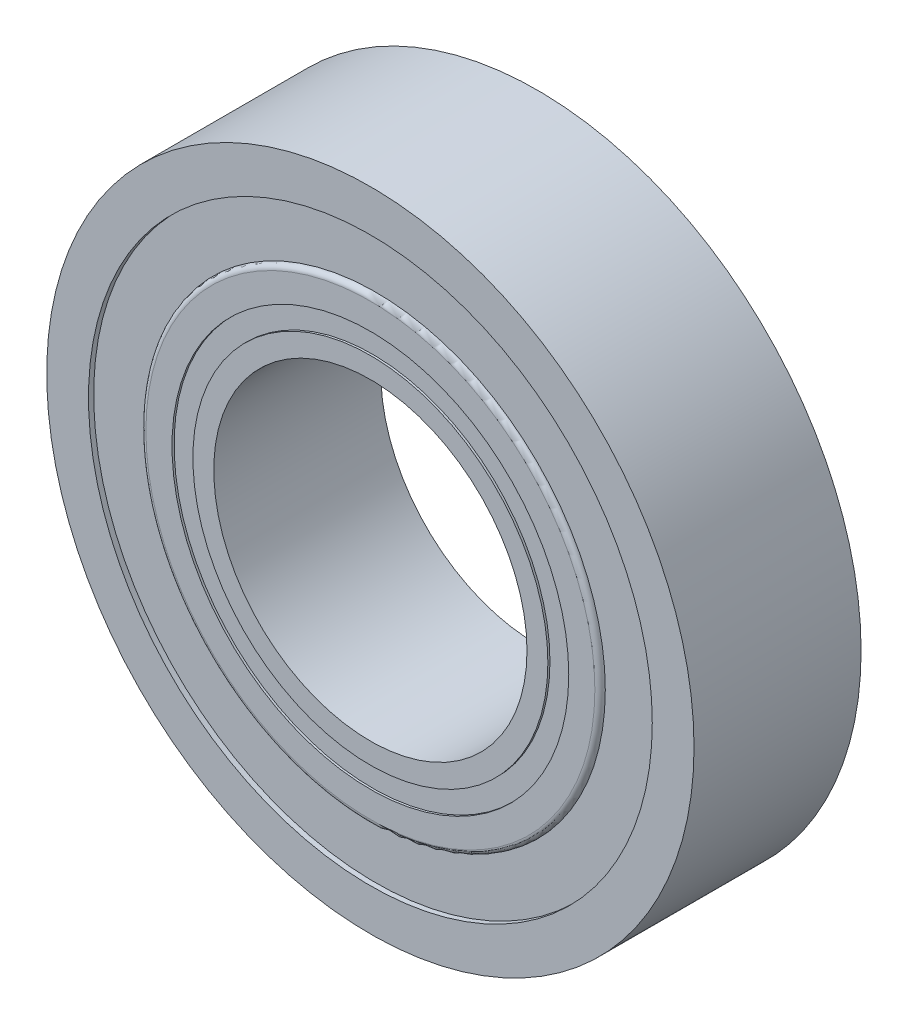
ISO-10303-21;
HEADER;
FILE_DESCRIPTION(('STEP AP214'),'2;1');
FILE_NAME('part.step','',(''),(''),'','','');
FILE_SCHEMA(('AUTOMOTIVE_DESIGN { 1 0 10303 214 1 1 1 1 }'));
ENDSEC;
DATA;
#1=APPLICATION_CONTEXT('core data for automotive mechanical design processes');
#2=APPLICATION_PROTOCOL_DEFINITION('international standard','automotive_design',2000,#1);
#3=PRODUCT_CONTEXT('',#1,'mechanical');
#4=PRODUCT('Part','Part','',(#3));
#5=PRODUCT_RELATED_PRODUCT_CATEGORY('part','',(#4));
#6=PRODUCT_DEFINITION_FORMATION('','',#4);
#7=PRODUCT_DEFINITION_CONTEXT('part definition',#1,'design');
#8=PRODUCT_DEFINITION('design','',#6,#7);
#9=PRODUCT_DEFINITION_SHAPE('','',#8);
#10=(LENGTH_UNIT() NAMED_UNIT(*) SI_UNIT(.MILLI.,.METRE.));
#11=(NAMED_UNIT(*) PLANE_ANGLE_UNIT() SI_UNIT($,.RADIAN.));
#12=(NAMED_UNIT(*) SI_UNIT($,.STERADIAN.) SOLID_ANGLE_UNIT());
#13=UNCERTAINTY_MEASURE_WITH_UNIT(LENGTH_MEASURE(1.E-05),#10,'distance_accuracy_value','');
#14=(GEOMETRIC_REPRESENTATION_CONTEXT(3) GLOBAL_UNCERTAINTY_ASSIGNED_CONTEXT((#13)) GLOBAL_UNIT_ASSIGNED_CONTEXT((#10,
#11,#12)) REPRESENTATION_CONTEXT('',''));
#15=CARTESIAN_POINT('',(0.,0.,0.));
#16=DIRECTION('',(0.,0.,1.));
#17=DIRECTION('',(1.,0.,0.));
#18=AXIS2_PLACEMENT_3D('',#15,#16,#17);
#19=CARTESIAN_POINT('',(0.,0.,0.));
#20=DIRECTION('',(0.,0.,1.));
#21=DIRECTION('',(1.,0.,0.));
#22=AXIS2_PLACEMENT_3D('',#19,#20,#21);
#23=PLANE('',#22);
#24=CARTESIAN_POINT('',(0.,0.,0.));
#25=DIRECTION('',(0.,0.,1.));
#26=DIRECTION('',(1.,0.,0.));
#27=AXIS2_PLACEMENT_3D('',#24,#25,#26);
#28=CIRCLE('',#27,15.);
#29=CARTESIAN_POINT('',(15.,0.,0.));
#30=VERTEX_POINT('',#29);
#31=EDGE_CURVE('E71',#30,#30,#28,.T.);
#32=ORIENTED_EDGE('',*,*,#31,.T.);
#33=EDGE_LOOP('',(#32));
#34=FACE_BOUND('',#33,.T.);
#35=CARTESIAN_POINT('',(0.,0.,0.));
#36=DIRECTION('',(0.,0.,-1.));
#37=DIRECTION('',(-1.,0.,0.));
#38=AXIS2_PLACEMENT_3D('',#35,#36,#37);
#39=CIRCLE('',#38,17.);
#40=CARTESIAN_POINT('',(-17.,0.,0.));
#41=VERTEX_POINT('',#40);
#42=EDGE_CURVE('E113',#41,#41,#39,.T.);
#43=ORIENTED_EDGE('',*,*,#42,.T.);
#44=EDGE_LOOP('',(#43));
#45=FACE_BOUND('',#44,.T.);
#46=ADVANCED_FACE('F50',(#34,#45),#23,.F.);
#47=CARTESIAN_POINT('',(0.,0.,16.));
#48=DIRECTION('',(0.,0.,1.));
#49=DIRECTION('',(1.,0.,0.));
#50=AXIS2_PLACEMENT_3D('',#47,#48,#49);
#51=PLANE('',#50);
#52=CARTESIAN_POINT('',(0.,0.,16.));
#53=DIRECTION('',(0.,0.,1.));
#54=DIRECTION('',(1.,0.,0.));
#55=AXIS2_PLACEMENT_3D('',#52,#53,#54);
#56=CIRCLE('',#55,15.);
#57=CARTESIAN_POINT('',(15.,0.,16.));
#58=VERTEX_POINT('',#57);
#59=EDGE_CURVE('E69',#58,#58,#56,.T.);
#60=ORIENTED_EDGE('',*,*,#59,.F.);
#61=EDGE_LOOP('',(#60));
#62=FACE_BOUND('',#61,.T.);
#63=CARTESIAN_POINT('',(0.,0.,16.));
#64=DIRECTION('',(0.,0.,1.));
#65=DIRECTION('',(1.,0.,0.));
#66=AXIS2_PLACEMENT_3D('',#63,#64,#65);
#67=CIRCLE('',#66,17.);
#68=CARTESIAN_POINT('',(17.,0.,16.));
#69=VERTEX_POINT('',#68);
#70=EDGE_CURVE('E101',#69,#69,#67,.T.);
#71=ORIENTED_EDGE('',*,*,#70,.T.);
#72=EDGE_LOOP('',(#71));
#73=FACE_BOUND('',#72,.T.);
#74=ADVANCED_FACE('F137',(#62,#73),#51,.T.);
#75=CARTESIAN_POINT('',(0.,0.,0.));
#76=DIRECTION('',(0.,0.,-1.));
#77=DIRECTION('',(-1.,0.,0.));
#78=AXIS2_PLACEMENT_3D('',#75,#76,#77);
#79=CIRCLE('',#78,19.);
#80=CARTESIAN_POINT('',(-19.,0.,0.));
#81=VERTEX_POINT('',#80);
#82=EDGE_CURVE('E107',#81,#81,#79,.T.);
#83=ORIENTED_EDGE('',*,*,#82,.F.);
#84=EDGE_LOOP('',(#83));
#85=FACE_BOUND('',#84,.T.);
#86=CARTESIAN_POINT('',(0.,0.,0.));
#87=DIRECTION('',(0.,0.,1.));
#88=DIRECTION('',(1.,0.,0.));
#89=AXIS2_PLACEMENT_3D('',#86,#87,#88);
#90=CIRCLE('',#89,21.5);
#91=CARTESIAN_POINT('',(21.5,0.,0.));
#92=VERTEX_POINT('',#91);
#93=EDGE_CURVE('E57',#92,#92,#90,.F.);
#94=ORIENTED_EDGE('',*,*,#93,.T.);
#95=EDGE_LOOP('',(#94));
#96=FACE_BOUND('',#95,.T.);
#97=ADVANCED_FACE('F134',(#85,#96),#23,.F.);
#98=CARTESIAN_POINT('',(0.,0.,16.));
#99=DIRECTION('',(0.,0.,1.));
#100=DIRECTION('',(1.,0.,0.));
#101=AXIS2_PLACEMENT_3D('',#98,#99,#100);
#102=CIRCLE('',#101,21.5);
#103=CARTESIAN_POINT('',(21.5,0.,16.));
#104=VERTEX_POINT('',#103);
#105=EDGE_CURVE('E12',#104,#104,#102,.T.);
#106=ORIENTED_EDGE('',*,*,#105,.T.);
#107=EDGE_LOOP('',(#106));
#108=FACE_BOUND('',#107,.T.);
#109=CARTESIAN_POINT('',(0.,0.,16.));
#110=DIRECTION('',(0.,0.,1.));
#111=DIRECTION('',(1.,0.,0.));
#112=AXIS2_PLACEMENT_3D('',#109,#110,#111);
#113=CIRCLE('',#112,19.);
#114=CARTESIAN_POINT('',(19.,0.,16.));
#115=VERTEX_POINT('',#114);
#116=EDGE_CURVE('E95',#115,#115,#113,.T.);
#117=ORIENTED_EDGE('',*,*,#116,.F.);
#118=EDGE_LOOP('',(#117));
#119=FACE_BOUND('',#118,.T.);
#120=ADVANCED_FACE('F136',(#108,#119),#51,.T.);
#121=CARTESIAN_POINT('',(0.,0.,16.));
#122=DIRECTION('',(0.,0.,1.));
#123=DIRECTION('',(1.,0.,0.));
#124=AXIS2_PLACEMENT_3D('',#121,#122,#123);
#125=CIRCLE('',#124,27.);
#126=CARTESIAN_POINT('',(27.,0.,16.));
#127=VERTEX_POINT('',#126);
#128=EDGE_CURVE('E77',#127,#127,#125,.T.);
#129=ORIENTED_EDGE('',*,*,#128,.F.);
#130=EDGE_LOOP('',(#129));
#131=FACE_BOUND('',#130,.T.);
#132=CARTESIAN_POINT('',(0.,0.,16.));
#133=DIRECTION('',(0.,0.,1.));
#134=DIRECTION('',(1.,0.,0.));
#135=AXIS2_PLACEMENT_3D('',#132,#133,#134);
#136=CIRCLE('',#135,31.);
#137=CARTESIAN_POINT('',(31.,0.,16.));
#138=VERTEX_POINT('',#137);
#139=EDGE_CURVE('E61',#138,#138,#136,.T.);
#140=ORIENTED_EDGE('',*,*,#139,.T.);
#141=EDGE_LOOP('',(#140));
#142=FACE_BOUND('',#141,.T.);
#143=ADVANCED_FACE('F144',(#131,#142),#51,.T.);
#144=CARTESIAN_POINT('',(0.,0.,0.));
#145=DIRECTION('',(0.,0.,-1.));
#146=DIRECTION('',(-1.,0.,0.));
#147=AXIS2_PLACEMENT_3D('',#144,#145,#146);
#148=CIRCLE('',#147,27.);
#149=CARTESIAN_POINT('',(-27.,0.,0.));
#150=VERTEX_POINT('',#149);
#151=EDGE_CURVE('E86',#150,#150,#148,.T.);
#152=ORIENTED_EDGE('',*,*,#151,.F.);
#153=EDGE_LOOP('',(#152));
#154=FACE_BOUND('',#153,.T.);
#155=CARTESIAN_POINT('',(0.,0.,0.));
#156=DIRECTION('',(0.,0.,1.));
#157=DIRECTION('',(1.,0.,0.));
#158=AXIS2_PLACEMENT_3D('',#155,#156,#157);
#159=CIRCLE('',#158,31.);
#160=CARTESIAN_POINT('',(31.,0.,0.));
#161=VERTEX_POINT('',#160);
#162=EDGE_CURVE('E65',#161,#161,#159,.T.);
#163=ORIENTED_EDGE('',*,*,#162,.F.);
#164=EDGE_LOOP('',(#163));
#165=FACE_BOUND('',#164,.T.);
#166=ADVANCED_FACE('F139',(#154,#165),#23,.F.);
#167=CARTESIAN_POINT('',(0.,0.,16.));
#168=DIRECTION('',(0.,0.,-1.));
#169=DIRECTION('',(-1.,0.,0.));
#170=AXIS2_PLACEMENT_3D('',#167,#168,#169);
#171=CYLINDRICAL_SURFACE('',#170,31.);
#172=ORIENTED_EDGE('',*,*,#139,.F.);
#173=EDGE_LOOP('',(#172));
#174=FACE_BOUND('',#173,.T.);
#175=ORIENTED_EDGE('',*,*,#162,.T.);
#176=EDGE_LOOP('',(#175));
#177=FACE_BOUND('',#176,.T.);
#178=ADVANCED_FACE('F149',(#174,#177),#171,.T.);
#179=CARTESIAN_POINT('',(0.,0.,16.));
#180=DIRECTION('',(0.,0.,-1.));
#181=DIRECTION('',(-1.,0.,0.));
#182=AXIS2_PLACEMENT_3D('',#179,#180,#181);
#183=CYLINDRICAL_SURFACE('',#182,15.);
#184=ORIENTED_EDGE('',*,*,#59,.T.);
#185=EDGE_LOOP('',(#184));
#186=FACE_BOUND('',#185,.T.);
#187=ORIENTED_EDGE('',*,*,#31,.F.);
#188=EDGE_LOOP('',(#187));
#189=FACE_BOUND('',#188,.T.);
#190=ADVANCED_FACE('F191',(#186,#189),#183,.F.);
#191=CARTESIAN_POINT('',(0.,0.,15.5));
#192=DIRECTION('',(0.,0.,1.));
#193=DIRECTION('',(1.,0.,0.));
#194=AXIS2_PLACEMENT_3D('',#191,#192,#193);
#195=CYLINDRICAL_SURFACE('',#194,27.);
#196=CARTESIAN_POINT('',(0.,0.,15.5));
#197=DIRECTION('',(0.,0.,1.));
#198=DIRECTION('',(1.,0.,0.));
#199=AXIS2_PLACEMENT_3D('',#196,#197,#198);
#200=CIRCLE('',#199,27.);
#201=CARTESIAN_POINT('',(27.,0.,15.5));
#202=VERTEX_POINT('',#201);
#203=EDGE_CURVE('E74',#202,#202,#200,.T.);
#204=ORIENTED_EDGE('',*,*,#203,.F.);
#205=EDGE_LOOP('',(#204));
#206=FACE_BOUND('',#205,.T.);
#207=ORIENTED_EDGE('',*,*,#128,.T.);
#208=EDGE_LOOP('',(#207));
#209=FACE_BOUND('',#208,.T.);
#210=ADVANCED_FACE('F187',(#206,#209),#195,.F.);
#211=CARTESIAN_POINT('',(0.,0.,15.5));
#212=DIRECTION('',(0.,0.,1.));
#213=DIRECTION('',(1.,0.,0.));
#214=AXIS2_PLACEMENT_3D('',#211,#212,#213);
#215=PLANE('',#214);
#216=CARTESIAN_POINT('',(0.,0.,15.5));
#217=DIRECTION('',(0.,0.,1.));
#218=DIRECTION('',(1.,0.,0.));
#219=AXIS2_PLACEMENT_3D('',#216,#217,#218);
#220=CIRCLE('',#219,22.);
#221=CARTESIAN_POINT('',(22.,0.,15.5));
#222=VERTEX_POINT('',#221);
#223=EDGE_CURVE('E80',#222,#222,#220,.T.);
#224=ORIENTED_EDGE('',*,*,#223,.F.);
#225=EDGE_LOOP('',(#224));
#226=FACE_BOUND('',#225,.T.);
#227=ORIENTED_EDGE('',*,*,#203,.T.);
#228=EDGE_LOOP('',(#227));
#229=FACE_BOUND('',#228,.T.);
#230=ADVANCED_FACE('F183',(#226,#229),#215,.T.);
#231=CARTESIAN_POINT('',(0.,0.,0.5));
#232=DIRECTION('',(0.,0.,-1.));
#233=DIRECTION('',(-1.,0.,0.));
#234=AXIS2_PLACEMENT_3D('',#231,#232,#233);
#235=CYLINDRICAL_SURFACE('',#234,27.);
#236=CARTESIAN_POINT('',(0.,0.,0.5));
#237=DIRECTION('',(0.,0.,-1.));
#238=DIRECTION('',(-1.,0.,0.));
#239=AXIS2_PLACEMENT_3D('',#236,#237,#238);
#240=CIRCLE('',#239,27.);
#241=CARTESIAN_POINT('',(-27.,0.,0.5));
#242=VERTEX_POINT('',#241);
#243=EDGE_CURVE('E85',#242,#242,#240,.T.);
#244=ORIENTED_EDGE('',*,*,#243,.F.);
#245=EDGE_LOOP('',(#244));
#246=FACE_BOUND('',#245,.T.);
#247=ORIENTED_EDGE('',*,*,#151,.T.);
#248=EDGE_LOOP('',(#247));
#249=FACE_BOUND('',#248,.T.);
#250=ADVANCED_FACE('F179',(#246,#249),#235,.F.);
#251=CARTESIAN_POINT('',(0.,0.,0.5));
#252=DIRECTION('',(0.,0.,-1.));
#253=DIRECTION('',(-1.,0.,0.));
#254=AXIS2_PLACEMENT_3D('',#251,#252,#253);
#255=PLANE('',#254);
#256=CARTESIAN_POINT('',(0.,0.,0.5));
#257=DIRECTION('',(0.,0.,-1.));
#258=DIRECTION('',(-1.,0.,0.));
#259=AXIS2_PLACEMENT_3D('',#256,#257,#258);
#260=CIRCLE('',#259,22.);
#261=CARTESIAN_POINT('',(-22.,0.,0.5));
#262=VERTEX_POINT('',#261);
#263=EDGE_CURVE('E89',#262,#262,#260,.T.);
#264=ORIENTED_EDGE('',*,*,#263,.F.);
#265=EDGE_LOOP('',(#264));
#266=FACE_BOUND('',#265,.T.);
#267=ORIENTED_EDGE('',*,*,#243,.T.);
#268=EDGE_LOOP('',(#267));
#269=FACE_BOUND('',#268,.T.);
#270=ADVANCED_FACE('F175',(#266,#269),#255,.T.);
#271=CARTESIAN_POINT('',(0.,0.,15.8));
#272=DIRECTION('',(0.,0.,1.));
#273=DIRECTION('',(1.,0.,0.));
#274=AXIS2_PLACEMENT_3D('',#271,#272,#273);
#275=CYLINDRICAL_SURFACE('',#274,19.);
#276=CARTESIAN_POINT('',(0.,0.,15.8));
#277=DIRECTION('',(0.,0.,1.));
#278=DIRECTION('',(1.,0.,0.));
#279=AXIS2_PLACEMENT_3D('',#276,#277,#278);
#280=CIRCLE('',#279,19.);
#281=CARTESIAN_POINT('',(19.,0.,15.8));
#282=VERTEX_POINT('',#281);
#283=EDGE_CURVE('E94',#282,#282,#280,.T.);
#284=ORIENTED_EDGE('',*,*,#283,.F.);
#285=EDGE_LOOP('',(#284));
#286=FACE_BOUND('',#285,.T.);
#287=ORIENTED_EDGE('',*,*,#116,.T.);
#288=EDGE_LOOP('',(#287));
#289=FACE_BOUND('',#288,.T.);
#290=ADVANCED_FACE('F171',(#286,#289),#275,.F.);
#291=CARTESIAN_POINT('',(0.,0.,15.8));
#292=DIRECTION('',(0.,0.,1.));
#293=DIRECTION('',(1.,0.,0.));
#294=AXIS2_PLACEMENT_3D('',#291,#292,#293);
#295=PLANE('',#294);
#296=CARTESIAN_POINT('',(0.,0.,15.8));
#297=DIRECTION('',(0.,0.,1.));
#298=DIRECTION('',(1.,0.,0.));
#299=AXIS2_PLACEMENT_3D('',#296,#297,#298);
#300=CIRCLE('',#299,17.);
#301=CARTESIAN_POINT('',(17.,0.,15.8));
#302=VERTEX_POINT('',#301);
#303=EDGE_CURVE('E98',#302,#302,#300,.T.);
#304=ORIENTED_EDGE('',*,*,#303,.F.);
#305=EDGE_LOOP('',(#304));
#306=FACE_BOUND('',#305,.T.);
#307=ORIENTED_EDGE('',*,*,#283,.T.);
#308=EDGE_LOOP('',(#307));
#309=FACE_BOUND('',#308,.T.);
#310=ADVANCED_FACE('F167',(#306,#309),#295,.T.);
#311=CARTESIAN_POINT('',(0.,0.,15.8));
#312=DIRECTION('',(0.,0.,1.));
#313=DIRECTION('',(1.,0.,0.));
#314=AXIS2_PLACEMENT_3D('',#311,#312,#313);
#315=CYLINDRICAL_SURFACE('',#314,17.);
#316=ORIENTED_EDGE('',*,*,#303,.T.);
#317=EDGE_LOOP('',(#316));
#318=FACE_BOUND('',#317,.T.);
#319=ORIENTED_EDGE('',*,*,#70,.F.);
#320=EDGE_LOOP('',(#319));
#321=FACE_BOUND('',#320,.T.);
#322=ADVANCED_FACE('F163',(#318,#321),#315,.T.);
#323=CARTESIAN_POINT('',(0.,0.,0.5));
#324=DIRECTION('',(0.,0.,1.));
#325=DIRECTION('',(1.,0.,0.));
#326=AXIS2_PLACEMENT_3D('',#323,#324,#325);
#327=TOROIDAL_SURFACE('',#326,21.5,0.5);
#328=ORIENTED_EDGE('',*,*,#263,.T.);
#329=EDGE_LOOP('',(#328));
#330=FACE_BOUND('',#329,.T.);
#331=ORIENTED_EDGE('',*,*,#93,.F.);
#332=EDGE_LOOP('',(#331));
#333=FACE_BOUND('',#332,.T.);
#334=ADVANCED_FACE('F166',(#330,#333),#327,.T.);
#335=CARTESIAN_POINT('',(0.,0.,15.5));
#336=DIRECTION('',(0.,0.,1.));
#337=DIRECTION('',(1.,0.,0.));
#338=AXIS2_PLACEMENT_3D('',#335,#336,#337);
#339=TOROIDAL_SURFACE('',#338,21.5,0.5);
#340=ORIENTED_EDGE('',*,*,#223,.T.);
#341=EDGE_LOOP('',(#340));
#342=FACE_BOUND('',#341,.T.);
#343=ORIENTED_EDGE('',*,*,#105,.F.);
#344=EDGE_LOOP('',(#343));
#345=FACE_BOUND('',#344,.T.);
#346=ADVANCED_FACE('F52',(#342,#345),#339,.T.);
#347=CARTESIAN_POINT('',(0.,0.,0.2));
#348=DIRECTION('',(0.,0.,-1.));
#349=DIRECTION('',(-1.,0.,0.));
#350=AXIS2_PLACEMENT_3D('',#347,#348,#349);
#351=CYLINDRICAL_SURFACE('',#350,19.);
#352=CARTESIAN_POINT('',(0.,0.,0.2));
#353=DIRECTION('',(0.,0.,-1.));
#354=DIRECTION('',(-1.,0.,0.));
#355=AXIS2_PLACEMENT_3D('',#352,#353,#354);
#356=CIRCLE('',#355,19.);
#357=CARTESIAN_POINT('',(-19.,0.,0.2));
#358=VERTEX_POINT('',#357);
#359=EDGE_CURVE('E104',#358,#358,#356,.T.);
#360=ORIENTED_EDGE('',*,*,#359,.F.);
#361=EDGE_LOOP('',(#360));
#362=FACE_BOUND('',#361,.T.);
#363=ORIENTED_EDGE('',*,*,#82,.T.);
#364=EDGE_LOOP('',(#363));
#365=FACE_BOUND('',#364,.T.);
#366=ADVANCED_FACE('F125',(#362,#365),#351,.F.);
#367=CARTESIAN_POINT('',(0.,0.,0.2));
#368=DIRECTION('',(0.,0.,-1.));
#369=DIRECTION('',(-1.,0.,0.));
#370=AXIS2_PLACEMENT_3D('',#367,#368,#369);
#371=PLANE('',#370);
#372=CARTESIAN_POINT('',(0.,0.,0.2));
#373=DIRECTION('',(0.,0.,-1.));
#374=DIRECTION('',(-1.,0.,0.));
#375=AXIS2_PLACEMENT_3D('',#372,#373,#374);
#376=CIRCLE('',#375,17.);
#377=CARTESIAN_POINT('',(-17.,0.,0.2));
#378=VERTEX_POINT('',#377);
#379=EDGE_CURVE('E110',#378,#378,#376,.T.);
#380=ORIENTED_EDGE('',*,*,#379,.F.);
#381=EDGE_LOOP('',(#380));
#382=FACE_BOUND('',#381,.T.);
#383=ORIENTED_EDGE('',*,*,#359,.T.);
#384=EDGE_LOOP('',(#383));
#385=FACE_BOUND('',#384,.T.);
#386=ADVANCED_FACE('F122',(#382,#385),#371,.T.);
#387=CARTESIAN_POINT('',(0.,0.,0.2));
#388=DIRECTION('',(0.,0.,-1.));
#389=DIRECTION('',(-1.,0.,0.));
#390=AXIS2_PLACEMENT_3D('',#387,#388,#389);
#391=CYLINDRICAL_SURFACE('',#390,17.);
#392=ORIENTED_EDGE('',*,*,#379,.T.);
#393=EDGE_LOOP('',(#392));
#394=FACE_BOUND('',#393,.T.);
#395=ORIENTED_EDGE('',*,*,#42,.F.);
#396=EDGE_LOOP('',(#395));
#397=FACE_BOUND('',#396,.T.);
#398=ADVANCED_FACE('F119',(#394,#397),#391,.T.);
#399=CLOSED_SHELL('',(#46,#74,#97,#120,#143,#166,#178,#190,#210,#230,#250,#270,#290,#310,#322,
#334,#346,#366,#386,#398));
#400=MANIFOLD_SOLID_BREP('B2',#399);
#401=ADVANCED_BREP_SHAPE_REPRESENTATION('',(#18,#400),#14);
#402=SHAPE_DEFINITION_REPRESENTATION(#9,#401);
ENDSEC;
END-ISO-10303-21;
